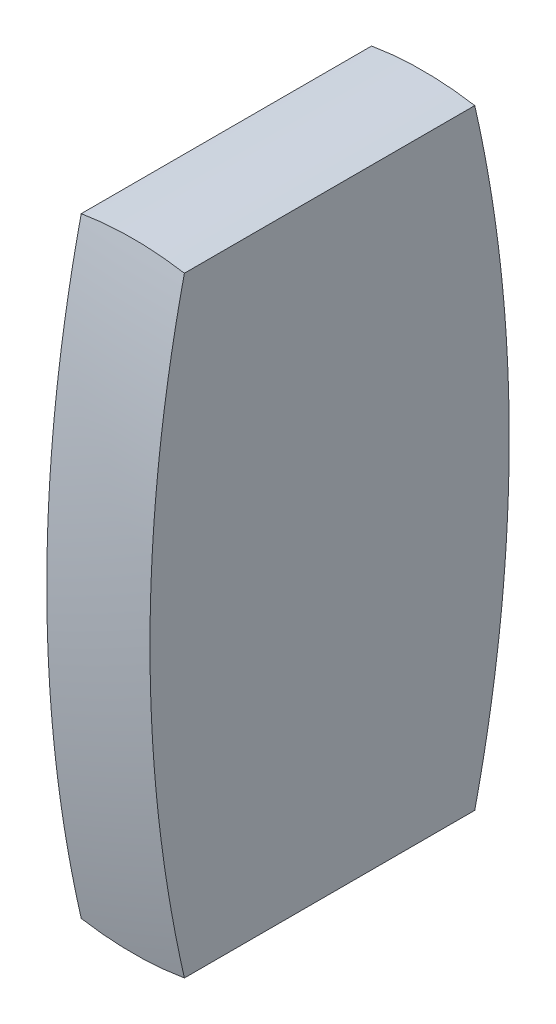
ISO-10303-21;
HEADER;
FILE_DESCRIPTION(('STEP AP214'),'2;1');
FILE_NAME('part.step','',(''),(''),'','','');
FILE_SCHEMA(('AUTOMOTIVE_DESIGN { 1 0 10303 214 1 1 1 1 }'));
ENDSEC;
DATA;
#1=APPLICATION_CONTEXT('core data for automotive mechanical design processes');
#2=APPLICATION_PROTOCOL_DEFINITION('international standard','automotive_design',2000,#1);
#3=PRODUCT_CONTEXT('',#1,'mechanical');
#4=PRODUCT('Part','Part','',(#3));
#5=PRODUCT_RELATED_PRODUCT_CATEGORY('part','',(#4));
#6=PRODUCT_DEFINITION_FORMATION('','',#4);
#7=PRODUCT_DEFINITION_CONTEXT('part definition',#1,'design');
#8=PRODUCT_DEFINITION('design','',#6,#7);
#9=PRODUCT_DEFINITION_SHAPE('','',#8);
#10=(LENGTH_UNIT() NAMED_UNIT(*) SI_UNIT(.MILLI.,.METRE.));
#11=(NAMED_UNIT(*) PLANE_ANGLE_UNIT() SI_UNIT($,.RADIAN.));
#12=(NAMED_UNIT(*) SI_UNIT($,.STERADIAN.) SOLID_ANGLE_UNIT());
#13=UNCERTAINTY_MEASURE_WITH_UNIT(LENGTH_MEASURE(1.E-05),#10,'distance_accuracy_value','');
#14=(GEOMETRIC_REPRESENTATION_CONTEXT(3) GLOBAL_UNCERTAINTY_ASSIGNED_CONTEXT((#13)) GLOBAL_UNIT_ASSIGNED_CONTEXT((#10,
#11,#12)) REPRESENTATION_CONTEXT('',''));
#15=CARTESIAN_POINT('',(0.,0.,0.));
#16=DIRECTION('',(0.,0.,1.));
#17=DIRECTION('',(1.,0.,0.));
#18=AXIS2_PLACEMENT_3D('',#15,#16,#17);
#19=CARTESIAN_POINT('',(0.,0.,-10.));
#20=DIRECTION('',(0.,0.,1.));
#21=DIRECTION('',(1.,0.,0.));
#22=AXIS2_PLACEMENT_3D('',#19,#20,#21);
#23=CYLINDRICAL_SURFACE('',#22,3.);
#24=DIRECTION('',(0.,0.,1.));
#25=VECTOR('',#24,1.);
#26=CARTESIAN_POINT('',(-0.5,2.95803989154981,-10.));
#27=LINE('',#26,#25);
#28=CARTESIAN_POINT('',(-0.5,2.95803989154981,1.40723735986958));
#29=VERTEX_POINT('',#28);
#30=CARTESIAN_POINT('',(-0.5,2.95803989154981,-1.40723735986958));
#31=VERTEX_POINT('',#30);
#32=EDGE_CURVE('E60',#29,#31,#27,.F.);
#33=ORIENTED_EDGE('',*,*,#32,.F.);
#34=CARTESIAN_POINT('',(0.,0.,1.40723735986958));
#35=DIRECTION('',(0.,0.,-1.));
#36=DIRECTION('',(-1.,0.,0.));
#37=AXIS2_PLACEMENT_3D('',#34,#35,#36);
#38=CIRCLE('',#37,3.);
#39=CARTESIAN_POINT('',(0.5,2.95803989154981,1.40723735986958));
#40=VERTEX_POINT('',#39);
#41=EDGE_CURVE('E97',#40,#29,#38,.F.);
#42=ORIENTED_EDGE('',*,*,#41,.F.);
#43=DIRECTION('',(0.,0.,1.));
#44=VECTOR('',#43,1.);
#45=CARTESIAN_POINT('',(0.5,2.95803989154981,-10.));
#46=LINE('',#45,#44);
#47=CARTESIAN_POINT('',(0.5,2.95803989154981,-1.40723735986958));
#48=VERTEX_POINT('',#47);
#49=EDGE_CURVE('E84',#48,#40,#46,.T.);
#50=ORIENTED_EDGE('',*,*,#49,.F.);
#51=CARTESIAN_POINT('',(0.,0.,-1.40723735986958));
#52=DIRECTION('',(0.,0.,1.));
#53=DIRECTION('',(1.,0.,0.));
#54=AXIS2_PLACEMENT_3D('',#51,#52,#53);
#55=CIRCLE('',#54,3.);
#56=EDGE_CURVE('E95',#31,#48,#55,.F.);
#57=ORIENTED_EDGE('',*,*,#56,.F.);
#58=EDGE_LOOP('',(#33,#42,#50,#57));
#59=FACE_BOUND('',#58,.T.);
#60=ADVANCED_FACE('F44',(#59),#23,.T.);
#61=DIRECTION('',(0.,0.,1.));
#62=VECTOR('',#61,1.);
#63=CARTESIAN_POINT('',(-0.5,-2.95803989154981,-10.));
#64=LINE('',#63,#62);
#65=CARTESIAN_POINT('',(-0.5,-2.95803989154981,-1.40723735986958));
#66=VERTEX_POINT('',#65);
#67=CARTESIAN_POINT('',(-0.5,-2.95803989154981,1.40723735986958));
#68=VERTEX_POINT('',#67);
#69=EDGE_CURVE('E115',#66,#68,#64,.T.);
#70=ORIENTED_EDGE('',*,*,#69,.F.);
#71=CARTESIAN_POINT('',(0.5,-2.95803989154981,-1.40723735986958));
#72=VERTEX_POINT('',#71);
#73=EDGE_CURVE('E102',#72,#66,#55,.F.);
#74=ORIENTED_EDGE('',*,*,#73,.F.);
#75=DIRECTION('',(0.,0.,1.));
#76=VECTOR('',#75,1.);
#77=CARTESIAN_POINT('',(0.5,-2.95803989154981,-10.));
#78=LINE('',#77,#76);
#79=CARTESIAN_POINT('',(0.5,-2.95803989154981,1.40723735986958));
#80=VERTEX_POINT('',#79);
#81=EDGE_CURVE('E67',#80,#72,#78,.F.);
#82=ORIENTED_EDGE('',*,*,#81,.F.);
#83=EDGE_CURVE('E91',#68,#80,#38,.F.);
#84=ORIENTED_EDGE('',*,*,#83,.F.);
#85=EDGE_LOOP('',(#70,#74,#82,#84));
#86=FACE_BOUND('',#85,.T.);
#87=ADVANCED_FACE('F46',(#86),#23,.T.);
#88=CARTESIAN_POINT('',(0.,0.,-11.55));
#89=DIRECTION('',(0.,0.,-1.));
#90=DIRECTION('',(-1.,0.,0.));
#91=AXIS2_PLACEMENT_3D('',#88,#89,#90);
#92=SPHERICAL_SURFACE('',#91,13.3);
#93=ORIENTED_EDGE('',*,*,#41,.T.);
#94=CARTESIAN_POINT('',(-0.5,0.,-11.55));
#95=DIRECTION('',(1.,0.,0.));
#96=DIRECTION('',(0.,0.,-1.));
#97=AXIS2_PLACEMENT_3D('',#94,#95,#96);
#98=CIRCLE('',#97,13.2905981806689);
#99=EDGE_CURVE('E103',#29,#68,#98,.T.);
#100=ORIENTED_EDGE('',*,*,#99,.T.);
#101=ORIENTED_EDGE('',*,*,#83,.T.);
#102=CARTESIAN_POINT('',(0.5,0.,-11.55));
#103=DIRECTION('',(-1.,0.,0.));
#104=DIRECTION('',(0.,0.,1.));
#105=AXIS2_PLACEMENT_3D('',#102,#103,#104);
#106=CIRCLE('',#105,13.2905981806689);
#107=EDGE_CURVE('E118',#80,#40,#106,.T.);
#108=ORIENTED_EDGE('',*,*,#107,.T.);
#109=EDGE_LOOP('',(#93,#100,#101,#108));
#110=FACE_BOUND('',#109,.T.);
#111=ADVANCED_FACE('F123',(#110),#92,.T.);
#112=CARTESIAN_POINT('',(0.,0.,11.55));
#113=DIRECTION('',(0.,0.,-1.));
#114=DIRECTION('',(-1.,0.,0.));
#115=AXIS2_PLACEMENT_3D('',#112,#113,#114);
#116=SPHERICAL_SURFACE('',#115,13.3);
#117=ORIENTED_EDGE('',*,*,#73,.T.);
#118=CARTESIAN_POINT('',(-0.5,0.,11.55));
#119=DIRECTION('',(1.,0.,0.));
#120=DIRECTION('',(0.,0.,-1.));
#121=AXIS2_PLACEMENT_3D('',#118,#119,#120);
#122=CIRCLE('',#121,13.2905981806689);
#123=EDGE_CURVE('E12',#66,#31,#122,.T.);
#124=ORIENTED_EDGE('',*,*,#123,.T.);
#125=ORIENTED_EDGE('',*,*,#56,.T.);
#126=CARTESIAN_POINT('',(0.5,0.,11.55));
#127=DIRECTION('',(-1.,0.,0.));
#128=DIRECTION('',(0.,0.,1.));
#129=AXIS2_PLACEMENT_3D('',#126,#127,#128);
#130=CIRCLE('',#129,13.2905981806689);
#131=EDGE_CURVE('E53',#48,#72,#130,.T.);
#132=ORIENTED_EDGE('',*,*,#131,.T.);
#133=EDGE_LOOP('',(#117,#124,#125,#132));
#134=FACE_BOUND('',#133,.T.);
#135=ADVANCED_FACE('F100',(#134),#116,.T.);
#136=CARTESIAN_POINT('',(0.5,-3.34522183333329,10.));
#137=DIRECTION('',(-1.,0.,0.));
#138=DIRECTION('',(0.,0.,1.));
#139=AXIS2_PLACEMENT_3D('',#136,#137,#138);
#140=PLANE('',#139);
#141=ORIENTED_EDGE('',*,*,#81,.T.);
#142=ORIENTED_EDGE('',*,*,#131,.F.);
#143=ORIENTED_EDGE('',*,*,#49,.T.);
#144=ORIENTED_EDGE('',*,*,#107,.F.);
#145=EDGE_LOOP('',(#141,#142,#143,#144));
#146=FACE_BOUND('',#145,.T.);
#147=ADVANCED_FACE('F83',(#146),#140,.F.);
#148=CARTESIAN_POINT('',(-0.5,-3.34522183333329,10.));
#149=DIRECTION('',(1.,0.,0.));
#150=DIRECTION('',(0.,0.,-1.));
#151=AXIS2_PLACEMENT_3D('',#148,#149,#150);
#152=PLANE('',#151);
#153=ORIENTED_EDGE('',*,*,#32,.T.);
#154=ORIENTED_EDGE('',*,*,#123,.F.);
#155=ORIENTED_EDGE('',*,*,#69,.T.);
#156=ORIENTED_EDGE('',*,*,#99,.F.);
#157=EDGE_LOOP('',(#153,#154,#155,#156));
#158=FACE_BOUND('',#157,.T.);
#159=ADVANCED_FACE('F127',(#158),#152,.F.);
#160=CLOSED_SHELL('',(#60,#87,#111,#135,#147,#159));
#161=MANIFOLD_SOLID_BREP('B2',#160);
#162=ADVANCED_BREP_SHAPE_REPRESENTATION('',(#18,#161),#14);
#163=SHAPE_DEFINITION_REPRESENTATION(#9,#162);
ENDSEC;
END-ISO-10303-21;
